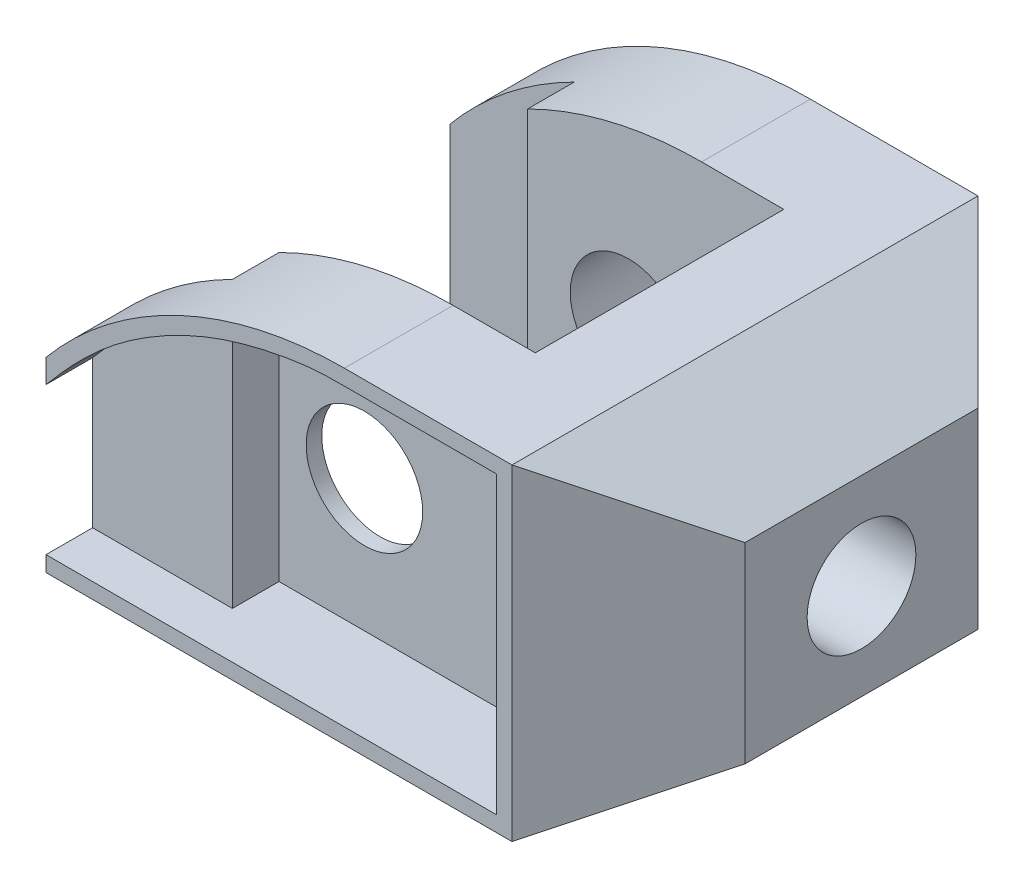
ISO-10303-21;
HEADER;
FILE_DESCRIPTION(('STEP AP214'),'2;1');
FILE_NAME('part.step','',(''),(''),'','','');
FILE_SCHEMA(('AUTOMOTIVE_DESIGN { 1 0 10303 214 1 1 1 1 }'));
ENDSEC;
DATA;
#1=APPLICATION_CONTEXT('core data for automotive mechanical design processes');
#2=APPLICATION_PROTOCOL_DEFINITION('international standard','automotive_design',2000,#1);
#3=PRODUCT_CONTEXT('',#1,'mechanical');
#4=PRODUCT('Part','Part','',(#3));
#5=PRODUCT_RELATED_PRODUCT_CATEGORY('part','',(#4));
#6=PRODUCT_DEFINITION_FORMATION('','',#4);
#7=PRODUCT_DEFINITION_CONTEXT('part definition',#1,'design');
#8=PRODUCT_DEFINITION('design','',#6,#7);
#9=PRODUCT_DEFINITION_SHAPE('','',#8);
#10=(LENGTH_UNIT() NAMED_UNIT(*) SI_UNIT(.MILLI.,.METRE.));
#11=(NAMED_UNIT(*) PLANE_ANGLE_UNIT() SI_UNIT($,.RADIAN.));
#12=(NAMED_UNIT(*) SI_UNIT($,.STERADIAN.) SOLID_ANGLE_UNIT());
#13=UNCERTAINTY_MEASURE_WITH_UNIT(LENGTH_MEASURE(1.E-05),#10,'distance_accuracy_value','');
#14=(GEOMETRIC_REPRESENTATION_CONTEXT(3) GLOBAL_UNCERTAINTY_ASSIGNED_CONTEXT((#13)) GLOBAL_UNIT_ASSIGNED_CONTEXT((#10,
#11,#12)) REPRESENTATION_CONTEXT('',''));
#15=CARTESIAN_POINT('',(0.,0.,0.));
#16=DIRECTION('',(0.,0.,1.));
#17=DIRECTION('',(1.,0.,0.));
#18=AXIS2_PLACEMENT_3D('',#15,#16,#17);
#19=CARTESIAN_POINT('',(29.,-5.,0.));
#20=DIRECTION('',(0.,0.,1.));
#21=DIRECTION('',(1.,0.,0.));
#22=AXIS2_PLACEMENT_3D('',#19,#20,#21);
#23=CYLINDRICAL_SURFACE('',#22,7.5);
#24=CARTESIAN_POINT('',(29.,-5.,46.));
#25=DIRECTION('',(0.,0.,1.));
#26=DIRECTION('',(1.,0.,0.));
#27=AXIS2_PLACEMENT_3D('',#24,#25,#26);
#28=CIRCLE('',#27,7.5);
#29=CARTESIAN_POINT('',(36.5,-5.,46.));
#30=VERTEX_POINT('',#29);
#31=EDGE_CURVE('E529',#30,#30,#28,.F.);
#32=ORIENTED_EDGE('',*,*,#31,.T.);
#33=EDGE_LOOP('',(#32));
#34=FACE_BOUND('',#33,.T.);
#35=CARTESIAN_POINT('',(29.,-5.,48.));
#36=DIRECTION('',(0.,0.,1.));
#37=DIRECTION('',(1.,0.,0.));
#38=AXIS2_PLACEMENT_3D('',#35,#36,#37);
#39=CIRCLE('',#38,7.5);
#40=CARTESIAN_POINT('',(36.5,-5.,48.));
#41=VERTEX_POINT('',#40);
#42=EDGE_CURVE('E342',#41,#41,#39,.F.);
#43=ORIENTED_EDGE('',*,*,#42,.F.);
#44=EDGE_LOOP('',(#43));
#45=FACE_BOUND('',#44,.T.);
#46=ADVANCED_FACE('F144',(#34,#45),#23,.F.);
#47=CARTESIAN_POINT('',(0.,0.,60.));
#48=DIRECTION('',(1.,0.,0.));
#49=DIRECTION('',(0.,0.,-1.));
#50=AXIS2_PLACEMENT_3D('',#47,#48,#49);
#51=PLANE('',#50);
#52=DIRECTION('',(0.,0.,-1.));
#53=VECTOR('',#52,1.);
#54=CARTESIAN_POINT('',(0.,-22.,60.));
#55=LINE('',#54,#53);
#56=CARTESIAN_POINT('',(0.,-22.,60.));
#57=VERTEX_POINT('',#56);
#58=CARTESIAN_POINT('',(0.,-22.,54.));
#59=VERTEX_POINT('',#58);
#60=EDGE_CURVE('E716',#57,#59,#55,.T.);
#61=ORIENTED_EDGE('',*,*,#60,.T.);
#62=DIRECTION('',(0.,1.,0.));
#63=VECTOR('',#62,1.);
#64=CARTESIAN_POINT('',(0.,-22.,54.));
#65=LINE('',#64,#63);
#66=CARTESIAN_POINT('',(0.,-3.04206073150586,54.));
#67=VERTEX_POINT('',#66);
#68=EDGE_CURVE('E719',#59,#67,#65,.T.);
#69=ORIENTED_EDGE('',*,*,#68,.T.);
#70=DIRECTION('',(0.,0.,-1.));
#71=VECTOR('',#70,1.);
#72=CARTESIAN_POINT('',(0.,-3.04206073150586,60.));
#73=LINE('',#72,#71);
#74=CARTESIAN_POINT('',(0.,-3.04206073150586,60.));
#75=VERTEX_POINT('',#74);
#76=EDGE_CURVE('E704',#75,#67,#73,.T.);
#77=ORIENTED_EDGE('',*,*,#76,.F.);
#78=DIRECTION('',(0.,-1.,0.));
#79=VECTOR('',#78,1.);
#80=CARTESIAN_POINT('',(0.,0.,60.));
#81=LINE('',#80,#79);
#82=CARTESIAN_POINT('',(0.,0.,60.));
#83=VERTEX_POINT('',#82);
#84=EDGE_CURVE('E600',#83,#75,#81,.T.);
#85=ORIENTED_EDGE('',*,*,#84,.F.);
#86=DIRECTION('',(0.,0.,-1.));
#87=VECTOR('',#86,1.);
#88=CARTESIAN_POINT('',(0.,0.,60.));
#89=LINE('',#88,#87);
#90=CARTESIAN_POINT('',(0.,0.,52.));
#91=VERTEX_POINT('',#90);
#92=EDGE_CURVE('E613',#83,#91,#89,.T.);
#93=ORIENTED_EDGE('',*,*,#92,.T.);
#94=DIRECTION('',(0.,1.,0.));
#95=VECTOR('',#94,1.);
#96=CARTESIAN_POINT('',(0.,-24.,52.));
#97=LINE('',#96,#95);
#98=CARTESIAN_POINT('',(0.,-24.,52.));
#99=VERTEX_POINT('',#98);
#100=EDGE_CURVE('E488',#99,#91,#97,.T.);
#101=ORIENTED_EDGE('',*,*,#100,.F.);
#102=DIRECTION('',(0.,0.,-1.));
#103=VECTOR('',#102,1.);
#104=CARTESIAN_POINT('',(0.,-24.,60.));
#105=LINE('',#104,#103);
#106=CARTESIAN_POINT('',(0.,-24.,60.));
#107=VERTEX_POINT('',#106);
#108=EDGE_CURVE('E618',#107,#99,#105,.T.);
#109=ORIENTED_EDGE('',*,*,#108,.F.);
#110=EDGE_CURVE('E419',#57,#107,#81,.T.);
#111=ORIENTED_EDGE('',*,*,#110,.F.);
#112=EDGE_LOOP('',(#61,#69,#77,#85,#93,#101,#109,#111));
#113=FACE_BOUND('',#112,.T.);
#114=ADVANCED_FACE('F682',(#113),#51,.F.);
#115=CARTESIAN_POINT('',(0.,0.,60.));
#116=DIRECTION('',(0.,0.,1.));
#117=DIRECTION('',(1.,0.,0.));
#118=AXIS2_PLACEMENT_3D('',#115,#116,#117);
#119=PLANE('',#118);
#120=DIRECTION('',(0.,1.,0.));
#121=VECTOR('',#120,1.);
#122=CARTESIAN_POINT('',(58.,-22.0000000000001,60.));
#123=LINE('',#122,#121);
#124=CARTESIAN_POINT('',(58.,-22.0000000000001,60.));
#125=VERTEX_POINT('',#124);
#126=CARTESIAN_POINT('',(58.,16.,60.));
#127=VERTEX_POINT('',#126);
#128=EDGE_CURVE('E445',#125,#127,#123,.T.);
#129=ORIENTED_EDGE('',*,*,#128,.F.);
#130=DIRECTION('',(-1.,0.,0.));
#131=VECTOR('',#130,1.);
#132=CARTESIAN_POINT('',(2.,-22.,60.));
#133=LINE('',#132,#131);
#134=EDGE_CURVE('E440',#125,#57,#133,.T.);
#135=ORIENTED_EDGE('',*,*,#134,.T.);
#136=ORIENTED_EDGE('',*,*,#110,.T.);
#137=DIRECTION('',(1.,0.,0.));
#138=VECTOR('',#137,1.);
#139=CARTESIAN_POINT('',(0.,-24.,60.));
#140=LINE('',#139,#138);
#141=CARTESIAN_POINT('',(60.,-24.,60.));
#142=VERTEX_POINT('',#141);
#143=EDGE_CURVE('E597',#107,#142,#140,.T.);
#144=ORIENTED_EDGE('',*,*,#143,.T.);
#145=DIRECTION('',(0.,1.,0.));
#146=VECTOR('',#145,1.);
#147=CARTESIAN_POINT('',(60.,-24.,60.));
#148=LINE('',#147,#146);
#149=CARTESIAN_POINT('',(60.,18.,60.));
#150=VERTEX_POINT('',#149);
#151=EDGE_CURVE('E553',#142,#150,#148,.T.);
#152=ORIENTED_EDGE('',*,*,#151,.T.);
#153=DIRECTION('',(-1.,0.,0.));
#154=VECTOR('',#153,1.);
#155=CARTESIAN_POINT('',(0.,18.,60.));
#156=LINE('',#155,#154);
#157=CARTESIAN_POINT('',(38.4187454245971,18.,60.));
#158=VERTEX_POINT('',#157);
#159=EDGE_CURVE('E588',#150,#158,#156,.T.);
#160=ORIENTED_EDGE('',*,*,#159,.T.);
#161=CARTESIAN_POINT('',(38.4187454245971,-32.,60.));
#162=DIRECTION('',(0.,0.,1.));
#163=DIRECTION('',(1.,0.,0.));
#164=AXIS2_PLACEMENT_3D('',#161,#162,#163);
#165=CIRCLE('',#164,50.);
#166=EDGE_CURVE('E592',#158,#83,#165,.T.);
#167=ORIENTED_EDGE('',*,*,#166,.T.);
#168=ORIENTED_EDGE('',*,*,#84,.T.);
#169=DIRECTION('',(-0.655018190479748,-0.755613108767071,0.));
#170=VECTOR('',#169,1.);
#171=CARTESIAN_POINT('',(1.99999999990717,-0.734909205901433,60.));
#172=LINE('',#171,#170);
#173=CARTESIAN_POINT('',(1.99999999990717,-0.734909205901433,60.));
#174=VERTEX_POINT('',#173);
#175=EDGE_CURVE('E400',#174,#75,#172,.T.);
#176=ORIENTED_EDGE('',*,*,#175,.F.);
#177=CARTESIAN_POINT('',(38.4187454245973,16.,60.));
#178=CARTESIAN_POINT('',(37.8594597344291,16.,60.));
#179=CARTESIAN_POINT('',(37.3001740442608,16.,60.));
#180=CARTESIAN_POINT('',(36.7409679291251,15.9956791731657,60.));
#181=CARTESIAN_POINT('',(35.0638270339129,15.9567917316575,60.));
#182=CARTESIAN_POINT('',(33.3888346645778,15.8012419656242,60.));
#183=CARTESIAN_POINT('',(32.2748255345968,15.6544752961856,60.));
#184=CARTESIAN_POINT('',(29.5006777065477,15.2018493005339,60.));
#185=CARTESIAN_POINT('',(26.7643270531672,14.5898443534607,60.));
#186=CARTESIAN_POINT('',(25.1400349332566,14.1598562930065,60.));
#187=CARTESIAN_POINT('',(21.9343098161441,13.1634926482811,60.));
#188=CARTESIAN_POINT('',(18.8299481013969,11.872719277128,60.));
#189=CARTESIAN_POINT('',(17.3066151513577,11.1577906166589,60.));
#190=CARTESIAN_POINT('',(14.3246591794342,9.59697025936475,60.));
#191=CARTESIAN_POINT('',(11.486151290793,7.79046565621635,60.));
#192=CARTESIAN_POINT('',(10.1080328527363,6.8258165538729,60.));
#193=CARTESIAN_POINT('',(7.88522025551142,5.11324040744338,60.));
#194=CARTESIAN_POINT('',(5.8063969048683,3.22974574057671,60.));
#195=CARTESIAN_POINT('',(4.99459382906211,2.450822480035,60.));
#196=CARTESIAN_POINT('',(3.90340812394486,1.34949177018028,60.));
#197=CARTESIAN_POINT('',(2.84725718543196,0.216614655587167,60.));
#198=CARTESIAN_POINT('',(2.56073938376813,-0.0970709785771248,60.));
#199=CARTESIAN_POINT('',(2.27811157008045,-0.414086439179782,60.));
#200=CARTESIAN_POINT('',(1.99999999990717,-0.734909205901433,60.));
#201=B_SPLINE_CURVE_WITH_KNOTS('',5,(#177,#178,#179,#180,#181,#182,#183,#184,#185,#186,#187,
#188,#189,#190,#191,#192,#193,#194,#195,#196,#197,#198,#199,#200),.UNSPECIFIED.,.F.,.F.,(6,3,3,
3,3,3,3,6),(0.,0.0677209449021635,0.203162834706491,0.406325669412981,0.609488504119471,
0.812651338825962,0.948596189742204,1.),.UNSPECIFIED.);
#202=CARTESIAN_POINT('',(38.4187454245973,16.,60.));
#203=VERTEX_POINT('',#202);
#204=EDGE_CURVE('E389',#203,#174,#201,.T.);
#205=ORIENTED_EDGE('',*,*,#204,.F.);
#206=DIRECTION('',(-1.,0.,0.));
#207=VECTOR('',#206,1.);
#208=CARTESIAN_POINT('',(58.,16.,60.));
#209=LINE('',#208,#207);
#210=EDGE_CURVE('E162',#127,#203,#209,.T.);
#211=ORIENTED_EDGE('',*,*,#210,.F.);
#212=EDGE_LOOP('',(#129,#135,#136,#144,#152,#160,#167,#168,#176,#205,#211));
#213=FACE_BOUND('',#212,.T.);
#214=ADVANCED_FACE('F676',(#213),#119,.T.);
#215=CARTESIAN_POINT('',(38.4187454245971,-32.,60.));
#216=DIRECTION('',(0.,0.,-1.));
#217=DIRECTION('',(-1.,0.,0.));
#218=AXIS2_PLACEMENT_3D('',#215,#216,#217);
#219=CYLINDRICAL_SURFACE('',#218,50.);
#220=CARTESIAN_POINT('',(0.,0.,8.));
#221=VERTEX_POINT('',#220);
#222=CARTESIAN_POINT('',(0.,0.,0.));
#223=VERTEX_POINT('',#222);
#224=EDGE_CURVE('E617',#221,#223,#89,.T.);
#225=ORIENTED_EDGE('',*,*,#224,.F.);
#226=CARTESIAN_POINT('',(38.4187454245971,-32.,8.));
#227=DIRECTION('',(0.,0.,-1.));
#228=DIRECTION('',(-1.,0.,0.));
#229=AXIS2_PLACEMENT_3D('',#226,#227,#228);
#230=CIRCLE('',#229,50.);
#231=CARTESIAN_POINT('',(16.,12.6922795747443,8.));
#232=VERTEX_POINT('',#231);
#233=EDGE_CURVE('E509',#221,#232,#230,.T.);
#234=ORIENTED_EDGE('',*,*,#233,.T.);
#235=DIRECTION('',(0.,0.,-1.));
#236=VECTOR('',#235,1.);
#237=CARTESIAN_POINT('',(16.,12.6922795747443,60.));
#238=LINE('',#237,#236);
#239=CARTESIAN_POINT('',(16.,12.6922795747443,14.));
#240=VERTEX_POINT('',#239);
#241=EDGE_CURVE('E501',#232,#240,#238,.F.);
#242=ORIENTED_EDGE('',*,*,#241,.T.);
#243=CARTESIAN_POINT('',(38.4187454245971,-32.,14.));
#244=DIRECTION('',(0.,0.,-1.));
#245=DIRECTION('',(-1.,0.,0.));
#246=AXIS2_PLACEMENT_3D('',#243,#244,#245);
#247=CIRCLE('',#246,50.);
#248=CARTESIAN_POINT('',(38.4187454245971,18.,14.));
#249=VERTEX_POINT('',#248);
#250=EDGE_CURVE('E542',#240,#249,#247,.T.);
#251=ORIENTED_EDGE('',*,*,#250,.T.);
#252=DIRECTION('',(0.,0.,-1.));
#253=VECTOR('',#252,1.);
#254=CARTESIAN_POINT('',(38.4187454245971,18.,60.));
#255=LINE('',#254,#253);
#256=CARTESIAN_POINT('',(38.4187454245971,18.,0.));
#257=VERTEX_POINT('',#256);
#258=EDGE_CURVE('E154',#249,#257,#255,.T.);
#259=ORIENTED_EDGE('',*,*,#258,.T.);
#260=CARTESIAN_POINT('',(38.4187454245971,-32.,0.));
#261=DIRECTION('',(0.,0.,1.));
#262=DIRECTION('',(1.,0.,0.));
#263=AXIS2_PLACEMENT_3D('',#260,#261,#262);
#264=CIRCLE('',#263,50.);
#265=EDGE_CURVE('E646',#257,#223,#264,.T.);
#266=ORIENTED_EDGE('',*,*,#265,.T.);
#267=EDGE_LOOP('',(#225,#234,#242,#251,#259,#266));
#268=FACE_BOUND('',#267,.T.);
#269=ADVANCED_FACE('F664',(#268),#219,.T.);
#270=CARTESIAN_POINT('',(0.,-24.,8.));
#271=VERTEX_POINT('',#270);
#272=CARTESIAN_POINT('',(0.,-24.,0.));
#273=VERTEX_POINT('',#272);
#274=EDGE_CURVE('E622',#271,#273,#105,.T.);
#275=ORIENTED_EDGE('',*,*,#274,.F.);
#276=DIRECTION('',(0.,1.,0.));
#277=VECTOR('',#276,1.);
#278=CARTESIAN_POINT('',(0.,-24.,8.));
#279=LINE('',#278,#277);
#280=EDGE_CURVE('E470',#271,#221,#279,.T.);
#281=ORIENTED_EDGE('',*,*,#280,.T.);
#282=ORIENTED_EDGE('',*,*,#224,.T.);
#283=DIRECTION('',(0.,-1.,0.));
#284=VECTOR('',#283,1.);
#285=CARTESIAN_POINT('',(0.,0.,0.));
#286=LINE('',#285,#284);
#287=EDGE_CURVE('E642',#223,#273,#286,.T.);
#288=ORIENTED_EDGE('',*,*,#287,.T.);
#289=EDGE_LOOP('',(#275,#281,#282,#288));
#290=FACE_BOUND('',#289,.T.);
#291=ADVANCED_FACE('F758',(#290),#51,.F.);
#292=CARTESIAN_POINT('',(29.,-5.,14.));
#293=DIRECTION('',(0.,0.,-1.));
#294=DIRECTION('',(-1.,0.,0.));
#295=AXIS2_PLACEMENT_3D('',#292,#293,#294);
#296=CIRCLE('',#295,7.5);
#297=CARTESIAN_POINT('',(21.5,-5.,14.));
#298=VERTEX_POINT('',#297);
#299=EDGE_CURVE('E541',#298,#298,#296,.F.);
#300=ORIENTED_EDGE('',*,*,#299,.T.);
#301=EDGE_LOOP('',(#300));
#302=FACE_BOUND('',#301,.T.);
#303=CARTESIAN_POINT('',(29.,-5.,0.));
#304=DIRECTION('',(0.,0.,1.));
#305=DIRECTION('',(1.,0.,0.));
#306=AXIS2_PLACEMENT_3D('',#303,#304,#305);
#307=CIRCLE('',#306,7.5);
#308=CARTESIAN_POINT('',(36.5,-5.,0.));
#309=VERTEX_POINT('',#308);
#310=EDGE_CURVE('E583',#309,#309,#307,.T.);
#311=ORIENTED_EDGE('',*,*,#310,.F.);
#312=EDGE_LOOP('',(#311));
#313=FACE_BOUND('',#312,.T.);
#314=ADVANCED_FACE('F753',(#302,#313),#23,.F.);
#315=CARTESIAN_POINT('',(0.,18.,60.));
#316=DIRECTION('',(0.,-1.,0.));
#317=DIRECTION('',(1.,0.,0.));
#318=AXIS2_PLACEMENT_3D('',#315,#316,#317);
#319=PLANE('',#318);
#320=ORIENTED_EDGE('',*,*,#258,.F.);
#321=DIRECTION('',(1.,0.,0.));
#322=VECTOR('',#321,1.);
#323=CARTESIAN_POINT('',(0.,18.,14.));
#324=LINE('',#323,#322);
#325=CARTESIAN_POINT('',(49.,18.,14.));
#326=VERTEX_POINT('',#325);
#327=EDGE_CURVE('E545',#249,#326,#324,.T.);
#328=ORIENTED_EDGE('',*,*,#327,.T.);
#329=DIRECTION('',(0.,0.,1.));
#330=VECTOR('',#329,1.);
#331=CARTESIAN_POINT('',(49.,18.,60.));
#332=LINE('',#331,#330);
#333=CARTESIAN_POINT('',(49.,18.,46.));
#334=VERTEX_POINT('',#333);
#335=EDGE_CURVE('E549',#326,#334,#332,.T.);
#336=ORIENTED_EDGE('',*,*,#335,.T.);
#337=DIRECTION('',(-1.,0.,0.));
#338=VECTOR('',#337,1.);
#339=CARTESIAN_POINT('',(0.,18.,46.));
#340=LINE('',#339,#338);
#341=CARTESIAN_POINT('',(38.4187454245971,18.,46.));
#342=VERTEX_POINT('',#341);
#343=EDGE_CURVE('E537',#334,#342,#340,.T.);
#344=ORIENTED_EDGE('',*,*,#343,.T.);
#345=EDGE_CURVE('E14',#158,#342,#255,.T.);
#346=ORIENTED_EDGE('',*,*,#345,.F.);
#347=ORIENTED_EDGE('',*,*,#159,.F.);
#348=DIRECTION('',(0.,0.,-1.));
#349=VECTOR('',#348,1.);
#350=CARTESIAN_POINT('',(60.,18.,60.));
#351=LINE('',#350,#349);
#352=CARTESIAN_POINT('',(60.,18.,0.));
#353=VERTEX_POINT('',#352);
#354=EDGE_CURVE('E635',#150,#353,#351,.T.);
#355=ORIENTED_EDGE('',*,*,#354,.T.);
#356=DIRECTION('',(-1.,0.,0.));
#357=VECTOR('',#356,1.);
#358=CARTESIAN_POINT('',(0.,18.,0.));
#359=LINE('',#358,#357);
#360=EDGE_CURVE('E587',#353,#257,#359,.T.);
#361=ORIENTED_EDGE('',*,*,#360,.T.);
#362=EDGE_LOOP('',(#320,#328,#336,#344,#346,#347,#355,#361));
#363=FACE_BOUND('',#362,.T.);
#364=ADVANCED_FACE('F146',(#363),#319,.F.);
#365=CARTESIAN_POINT('',(38.4187454245971,-32.,46.));
#366=DIRECTION('',(0.,0.,1.));
#367=DIRECTION('',(1.,0.,0.));
#368=AXIS2_PLACEMENT_3D('',#365,#366,#367);
#369=CIRCLE('',#368,50.);
#370=CARTESIAN_POINT('',(16.,12.6922795747443,46.));
#371=VERTEX_POINT('',#370);
#372=EDGE_CURVE('E533',#342,#371,#369,.T.);
#373=ORIENTED_EDGE('',*,*,#372,.T.);
#374=DIRECTION('',(0.,0.,-1.));
#375=VECTOR('',#374,1.);
#376=CARTESIAN_POINT('',(16.,12.6922795747443,60.));
#377=LINE('',#376,#375);
#378=CARTESIAN_POINT('',(16.,12.6922795747443,52.));
#379=VERTEX_POINT('',#378);
#380=EDGE_CURVE('E474',#371,#379,#377,.F.);
#381=ORIENTED_EDGE('',*,*,#380,.T.);
#382=CARTESIAN_POINT('',(38.4187454245971,-32.,52.));
#383=DIRECTION('',(0.,0.,1.));
#384=DIRECTION('',(1.,0.,0.));
#385=AXIS2_PLACEMENT_3D('',#382,#383,#384);
#386=CIRCLE('',#385,50.);
#387=EDGE_CURVE('E505',#379,#91,#386,.T.);
#388=ORIENTED_EDGE('',*,*,#387,.T.);
#389=ORIENTED_EDGE('',*,*,#92,.F.);
#390=ORIENTED_EDGE('',*,*,#166,.F.);
#391=ORIENTED_EDGE('',*,*,#345,.T.);
#392=EDGE_LOOP('',(#373,#381,#388,#389,#390,#391));
#393=FACE_BOUND('',#392,.T.);
#394=ADVANCED_FACE('F699',(#393),#219,.T.);
#395=CARTESIAN_POINT('',(0.,-24.,60.));
#396=DIRECTION('',(0.,1.,0.));
#397=DIRECTION('',(0.,0.,1.));
#398=AXIS2_PLACEMENT_3D('',#395,#396,#397);
#399=PLANE('',#398);
#400=DIRECTION('',(0.,0.,-1.));
#401=VECTOR('',#400,1.);
#402=CARTESIAN_POINT('',(16.,-24.,14.));
#403=LINE('',#402,#401);
#404=CARTESIAN_POINT('',(16.,-24.,14.));
#405=VERTEX_POINT('',#404);
#406=CARTESIAN_POINT('',(16.,-24.,8.));
#407=VERTEX_POINT('',#406);
#408=EDGE_CURVE('E170',#405,#407,#403,.T.);
#409=ORIENTED_EDGE('',*,*,#408,.T.);
#410=DIRECTION('',(-1.,0.,0.));
#411=VECTOR('',#410,1.);
#412=CARTESIAN_POINT('',(0.,-24.,8.));
#413=LINE('',#412,#411);
#414=EDGE_CURVE('E464',#407,#271,#413,.T.);
#415=ORIENTED_EDGE('',*,*,#414,.T.);
#416=ORIENTED_EDGE('',*,*,#274,.T.);
#417=DIRECTION('',(1.,0.,0.));
#418=VECTOR('',#417,1.);
#419=CARTESIAN_POINT('',(0.,-24.,0.));
#420=LINE('',#419,#418);
#421=CARTESIAN_POINT('',(60.,-24.,0.));
#422=VERTEX_POINT('',#421);
#423=EDGE_CURVE('E593',#273,#422,#420,.T.);
#424=ORIENTED_EDGE('',*,*,#423,.T.);
#425=DIRECTION('',(0.,0.,-1.));
#426=VECTOR('',#425,1.);
#427=CARTESIAN_POINT('',(60.,-24.,60.));
#428=LINE('',#427,#426);
#429=EDGE_CURVE('E623',#142,#422,#428,.T.);
#430=ORIENTED_EDGE('',*,*,#429,.F.);
#431=ORIENTED_EDGE('',*,*,#143,.F.);
#432=ORIENTED_EDGE('',*,*,#108,.T.);
#433=DIRECTION('',(1.,0.,0.));
#434=VECTOR('',#433,1.);
#435=CARTESIAN_POINT('',(0.,-24.,52.));
#436=LINE('',#435,#434);
#437=CARTESIAN_POINT('',(16.,-24.,52.));
#438=VERTEX_POINT('',#437);
#439=EDGE_CURVE('E461',#99,#438,#436,.T.);
#440=ORIENTED_EDGE('',*,*,#439,.T.);
#441=DIRECTION('',(0.,0.,-1.));
#442=VECTOR('',#441,1.);
#443=CARTESIAN_POINT('',(16.,-24.,46.));
#444=LINE('',#443,#442);
#445=CARTESIAN_POINT('',(16.,-24.,46.));
#446=VERTEX_POINT('',#445);
#447=EDGE_CURVE('E484',#438,#446,#444,.T.);
#448=ORIENTED_EDGE('',*,*,#447,.T.);
#449=DIRECTION('',(1.,0.,0.));
#450=VECTOR('',#449,1.);
#451=CARTESIAN_POINT('',(0.,-24.,46.));
#452=LINE('',#451,#450);
#453=CARTESIAN_POINT('',(49.,-24.,46.));
#454=VERTEX_POINT('',#453);
#455=EDGE_CURVE('E513',#446,#454,#452,.T.);
#456=ORIENTED_EDGE('',*,*,#455,.T.);
#457=DIRECTION('',(0.,0.,-1.));
#458=VECTOR('',#457,1.);
#459=CARTESIAN_POINT('',(49.,-24.,14.));
#460=LINE('',#459,#458);
#461=CARTESIAN_POINT('',(49.,-24.,14.));
#462=VERTEX_POINT('',#461);
#463=EDGE_CURVE('E516',#454,#462,#460,.T.);
#464=ORIENTED_EDGE('',*,*,#463,.T.);
#465=DIRECTION('',(-1.,0.,0.));
#466=VECTOR('',#465,1.);
#467=CARTESIAN_POINT('',(0.,-24.,14.));
#468=LINE('',#467,#466);
#469=EDGE_CURVE('E520',#462,#405,#468,.T.);
#470=ORIENTED_EDGE('',*,*,#469,.T.);
#471=EDGE_LOOP('',(#409,#415,#416,#424,#430,#431,#432,#440,#448,#456,#464,#470));
#472=FACE_BOUND('',#471,.T.);
#473=ADVANCED_FACE('F684',(#472),#399,.F.);
#474=CARTESIAN_POINT('',(25.3923048454134,-43.9807621135332,60.));
#475=DIRECTION('',(-0.500000000000001,0.866025403784438,0.));
#476=DIRECTION('',(-0.866025403784438,-0.500000000000001,0.));
#477=AXIS2_PLACEMENT_3D('',#474,#475,#476);
#478=PLANE('',#477);
#479=ORIENTED_EDGE('',*,*,#429,.T.);
#480=DIRECTION('',(0.65465367070798,0.37796447300923,0.654653670707973));
#481=VECTOR('',#480,1.);
#482=CARTESIAN_POINT('',(65.9384599116645,-20.5714285714287,5.93845991166445));
#483=LINE('',#482,#481);
#484=CARTESIAN_POINT('',(75.,-15.3397459621556,14.9999999999998));
#485=VERTEX_POINT('',#484);
#486=EDGE_CURVE('E571',#422,#485,#483,.T.);
#487=ORIENTED_EDGE('',*,*,#486,.T.);
#488=DIRECTION('',(0.,0.,-1.));
#489=VECTOR('',#488,1.);
#490=CARTESIAN_POINT('',(75.,-15.3397459621556,60.));
#491=LINE('',#490,#489);
#492=CARTESIAN_POINT('',(75.,-15.3397459621556,45.0000000000002));
#493=VERTEX_POINT('',#492);
#494=EDGE_CURVE('E627',#493,#485,#491,.T.);
#495=ORIENTED_EDGE('',*,*,#494,.F.);
#496=DIRECTION('',(-0.65465367070798,-0.37796447300923,0.654653670707973));
#497=VECTOR('',#496,1.);
#498=CARTESIAN_POINT('',(40.2241741973789,-35.4175783505905,79.7758258026209));
#499=LINE('',#498,#497);
#500=EDGE_CURVE('E579',#493,#142,#499,.T.);
#501=ORIENTED_EDGE('',*,*,#500,.T.);
#502=EDGE_LOOP('',(#479,#487,#495,#501));
#503=FACE_BOUND('',#502,.T.);
#504=ADVANCED_FACE('F686',(#503),#478,.F.);
#505=CARTESIAN_POINT('',(75.,0.,60.));
#506=DIRECTION('',(-1.,0.,0.));
#507=DIRECTION('',(0.,0.,1.));
#508=AXIS2_PLACEMENT_3D('',#505,#506,#507);
#509=PLANE('',#508);
#510=CARTESIAN_POINT('',(75.,-3.00000000000001,30.));
#511=DIRECTION('',(-1.,0.,0.));
#512=DIRECTION('',(0.,0.,1.));
#513=AXIS2_PLACEMENT_3D('',#510,#511,#512);
#514=CIRCLE('',#513,7.);
#515=CARTESIAN_POINT('',(75.,-3.00000000000001,37.));
#516=VERTEX_POINT('',#515);
#517=EDGE_CURVE('E457',#516,#516,#514,.T.);
#518=ORIENTED_EDGE('',*,*,#517,.T.);
#519=EDGE_LOOP('',(#518));
#520=FACE_BOUND('',#519,.T.);
#521=ORIENTED_EDGE('',*,*,#494,.T.);
#522=DIRECTION('',(0.,1.,0.));
#523=VECTOR('',#522,1.);
#524=CARTESIAN_POINT('',(75.,-24.,14.9999999999998));
#525=LINE('',#524,#523);
#526=CARTESIAN_POINT('',(75.,9.33974596215575,14.9999999999998));
#527=VERTEX_POINT('',#526);
#528=EDGE_CURVE('E554',#485,#527,#525,.T.);
#529=ORIENTED_EDGE('',*,*,#528,.T.);
#530=DIRECTION('',(0.,0.,-1.));
#531=VECTOR('',#530,1.);
#532=CARTESIAN_POINT('',(75.,9.33974596215575,60.));
#533=LINE('',#532,#531);
#534=CARTESIAN_POINT('',(75.,9.33974596215573,45.0000000000002));
#535=VERTEX_POINT('',#534);
#536=EDGE_CURVE('E631',#535,#527,#533,.T.);
#537=ORIENTED_EDGE('',*,*,#536,.F.);
#538=DIRECTION('',(0.,1.,0.));
#539=VECTOR('',#538,1.);
#540=CARTESIAN_POINT('',(75.,-24.,45.0000000000002));
#541=LINE('',#540,#539);
#542=EDGE_CURVE('E562',#493,#535,#541,.T.);
#543=ORIENTED_EDGE('',*,*,#542,.F.);
#544=EDGE_LOOP('',(#521,#529,#537,#543));
#545=FACE_BOUND('',#544,.T.);
#546=ADVANCED_FACE('F693',(#520,#545),#509,.F.);
#547=CARTESIAN_POINT('',(22.7942286340595,39.4807621135331,60.));
#548=DIRECTION('',(-0.499999999999994,-0.866025403784442,0.));
#549=DIRECTION('',(0.866025403784442,-0.499999999999994,0.));
#550=AXIS2_PLACEMENT_3D('',#547,#548,#549);
#551=PLANE('',#550);
#552=ORIENTED_EDGE('',*,*,#536,.T.);
#553=DIRECTION('',(-0.654653670707982,0.377964473009224,-0.654653670707975));
#554=VECTOR('',#553,1.);
#555=CARTESIAN_POINT('',(64.4538449337483,15.4285714285716,4.45384493374822));
#556=LINE('',#555,#554);
#557=EDGE_CURVE('E558',#527,#353,#556,.T.);
#558=ORIENTED_EDGE('',*,*,#557,.T.);
#559=ORIENTED_EDGE('',*,*,#354,.F.);
#560=DIRECTION('',(0.654653670707982,-0.377964473009224,-0.654653670707975));
#561=VECTOR('',#560,1.);
#562=CARTESIAN_POINT('',(38.7395592194625,30.2747212077332,81.2604407805373));
#563=LINE('',#562,#561);
#564=EDGE_CURVE('E575',#150,#535,#563,.T.);
#565=ORIENTED_EDGE('',*,*,#564,.T.);
#566=EDGE_LOOP('',(#552,#558,#559,#565));
#567=FACE_BOUND('',#566,.T.);
#568=ADVANCED_FACE('F695',(#567),#551,.F.);
#569=CARTESIAN_POINT('',(0.,0.,0.));
#570=DIRECTION('',(0.,0.,1.));
#571=DIRECTION('',(1.,0.,0.));
#572=AXIS2_PLACEMENT_3D('',#569,#570,#571);
#573=PLANE('',#572);
#574=ORIENTED_EDGE('',*,*,#310,.T.);
#575=EDGE_LOOP('',(#574));
#576=FACE_BOUND('',#575,.T.);
#577=ORIENTED_EDGE('',*,*,#360,.F.);
#578=DIRECTION('',(0.,1.,0.));
#579=VECTOR('',#578,1.);
#580=CARTESIAN_POINT('',(60.,-24.,0.));
#581=LINE('',#580,#579);
#582=EDGE_CURVE('E559',#422,#353,#581,.T.);
#583=ORIENTED_EDGE('',*,*,#582,.F.);
#584=ORIENTED_EDGE('',*,*,#423,.F.);
#585=ORIENTED_EDGE('',*,*,#287,.F.);
#586=ORIENTED_EDGE('',*,*,#265,.F.);
#587=EDGE_LOOP('',(#577,#583,#584,#585,#586));
#588=FACE_BOUND('',#587,.T.);
#589=ADVANCED_FACE('F659',(#576,#588),#573,.F.);
#590=CARTESIAN_POINT('',(60.,-24.,0.));
#591=DIRECTION('',(-0.707106781186544,0.,0.707106781186551));
#592=DIRECTION('',(0.707106781186551,0.,0.707106781186544));
#593=AXIS2_PLACEMENT_3D('',#590,#591,#592);
#594=PLANE('',#593);
#595=ORIENTED_EDGE('',*,*,#582,.T.);
#596=ORIENTED_EDGE('',*,*,#557,.F.);
#597=ORIENTED_EDGE('',*,*,#528,.F.);
#598=ORIENTED_EDGE('',*,*,#486,.F.);
#599=EDGE_LOOP('',(#595,#596,#597,#598));
#600=FACE_BOUND('',#599,.T.);
#601=ADVANCED_FACE('F773',(#600),#594,.F.);
#602=CARTESIAN_POINT('',(75.,-24.,45.0000000000002));
#603=DIRECTION('',(-0.707106781186544,0.,-0.707106781186551));
#604=DIRECTION('',(-0.707106781186551,0.,0.707106781186544));
#605=AXIS2_PLACEMENT_3D('',#602,#603,#604);
#606=PLANE('',#605);
#607=ORIENTED_EDGE('',*,*,#542,.T.);
#608=ORIENTED_EDGE('',*,*,#564,.F.);
#609=ORIENTED_EDGE('',*,*,#151,.F.);
#610=ORIENTED_EDGE('',*,*,#500,.F.);
#611=EDGE_LOOP('',(#607,#608,#609,#610));
#612=FACE_BOUND('',#611,.T.);
#613=ADVANCED_FACE('F690',(#612),#606,.F.);
#614=CARTESIAN_POINT('',(49.,-24.,14.));
#615=DIRECTION('',(1.,0.,0.));
#616=DIRECTION('',(0.,0.,-1.));
#617=AXIS2_PLACEMENT_3D('',#614,#615,#616);
#618=PLANE('',#617);
#619=CARTESIAN_POINT('',(49.,-3.00000000000001,30.));
#620=DIRECTION('',(1.,0.,0.));
#621=DIRECTION('',(0.,0.,-1.));
#622=AXIS2_PLACEMENT_3D('',#619,#620,#621);
#623=CIRCLE('',#622,7.);
#624=CARTESIAN_POINT('',(49.,-3.00000000000001,23.));
#625=VERTEX_POINT('',#624);
#626=EDGE_CURVE('E394',#625,#625,#623,.T.);
#627=ORIENTED_EDGE('',*,*,#626,.T.);
#628=EDGE_LOOP('',(#627));
#629=FACE_BOUND('',#628,.T.);
#630=DIRECTION('',(0.,1.,0.));
#631=VECTOR('',#630,1.);
#632=CARTESIAN_POINT('',(49.,-24.,14.));
#633=LINE('',#632,#631);
#634=EDGE_CURVE('E525',#462,#326,#633,.T.);
#635=ORIENTED_EDGE('',*,*,#634,.F.);
#636=ORIENTED_EDGE('',*,*,#463,.F.);
#637=DIRECTION('',(0.,1.,0.));
#638=VECTOR('',#637,1.);
#639=CARTESIAN_POINT('',(49.,-24.,46.));
#640=LINE('',#639,#638);
#641=EDGE_CURVE('E524',#454,#334,#640,.T.);
#642=ORIENTED_EDGE('',*,*,#641,.T.);
#643=ORIENTED_EDGE('',*,*,#335,.F.);
#644=EDGE_LOOP('',(#635,#636,#642,#643));
#645=FACE_BOUND('',#644,.T.);
#646=ADVANCED_FACE('F822',(#629,#645),#618,.F.);
#647=CARTESIAN_POINT('',(0.,-24.,14.));
#648=DIRECTION('',(0.,0.,-1.));
#649=DIRECTION('',(-1.,0.,0.));
#650=AXIS2_PLACEMENT_3D('',#647,#648,#649);
#651=PLANE('',#650);
#652=ORIENTED_EDGE('',*,*,#299,.F.);
#653=EDGE_LOOP('',(#652));
#654=FACE_BOUND('',#653,.T.);
#655=ORIENTED_EDGE('',*,*,#250,.F.);
#656=DIRECTION('',(0.,1.,0.));
#657=VECTOR('',#656,1.);
#658=CARTESIAN_POINT('',(16.,-24.,14.));
#659=LINE('',#658,#657);
#660=EDGE_CURVE('E469',#405,#240,#659,.T.);
#661=ORIENTED_EDGE('',*,*,#660,.F.);
#662=ORIENTED_EDGE('',*,*,#469,.F.);
#663=ORIENTED_EDGE('',*,*,#634,.T.);
#664=ORIENTED_EDGE('',*,*,#327,.F.);
#665=EDGE_LOOP('',(#655,#661,#662,#663,#664));
#666=FACE_BOUND('',#665,.T.);
#667=ADVANCED_FACE('F827',(#654,#666),#651,.F.);
#668=CARTESIAN_POINT('',(0.,-24.,46.));
#669=DIRECTION('',(0.,0.,1.));
#670=DIRECTION('',(1.,0.,0.));
#671=AXIS2_PLACEMENT_3D('',#668,#669,#670);
#672=PLANE('',#671);
#673=ORIENTED_EDGE('',*,*,#31,.F.);
#674=EDGE_LOOP('',(#673));
#675=FACE_BOUND('',#674,.T.);
#676=ORIENTED_EDGE('',*,*,#455,.F.);
#677=DIRECTION('',(0.,1.,0.));
#678=VECTOR('',#677,1.);
#679=CARTESIAN_POINT('',(16.,-24.,46.));
#680=LINE('',#679,#678);
#681=EDGE_CURVE('E465',#446,#371,#680,.T.);
#682=ORIENTED_EDGE('',*,*,#681,.T.);
#683=ORIENTED_EDGE('',*,*,#372,.F.);
#684=ORIENTED_EDGE('',*,*,#343,.F.);
#685=ORIENTED_EDGE('',*,*,#641,.F.);
#686=EDGE_LOOP('',(#676,#682,#683,#684,#685));
#687=FACE_BOUND('',#686,.T.);
#688=ADVANCED_FACE('F876',(#675,#687),#672,.F.);
#689=CARTESIAN_POINT('',(0.,-24.,52.));
#690=DIRECTION('',(0.,0.,1.));
#691=DIRECTION('',(1.,0.,0.));
#692=AXIS2_PLACEMENT_3D('',#689,#690,#691);
#693=PLANE('',#692);
#694=DIRECTION('',(0.,1.,0.));
#695=VECTOR('',#694,1.);
#696=CARTESIAN_POINT('',(16.,-24.,52.));
#697=LINE('',#696,#695);
#698=EDGE_CURVE('E492',#438,#379,#697,.T.);
#699=ORIENTED_EDGE('',*,*,#698,.F.);
#700=ORIENTED_EDGE('',*,*,#439,.F.);
#701=ORIENTED_EDGE('',*,*,#100,.T.);
#702=ORIENTED_EDGE('',*,*,#387,.F.);
#703=EDGE_LOOP('',(#699,#700,#701,#702));
#704=FACE_BOUND('',#703,.T.);
#705=ADVANCED_FACE('F866',(#704),#693,.F.);
#706=CARTESIAN_POINT('',(16.,-24.,46.));
#707=DIRECTION('',(1.,0.,0.));
#708=DIRECTION('',(0.,1.,0.));
#709=AXIS2_PLACEMENT_3D('',#706,#707,#708);
#710=PLANE('',#709);
#711=ORIENTED_EDGE('',*,*,#681,.F.);
#712=ORIENTED_EDGE('',*,*,#447,.F.);
#713=ORIENTED_EDGE('',*,*,#698,.T.);
#714=ORIENTED_EDGE('',*,*,#380,.F.);
#715=EDGE_LOOP('',(#711,#712,#713,#714));
#716=FACE_BOUND('',#715,.T.);
#717=ADVANCED_FACE('F856',(#716),#710,.F.);
#718=CARTESIAN_POINT('',(0.,-24.,8.));
#719=DIRECTION('',(0.,0.,-1.));
#720=DIRECTION('',(-1.,0.,0.));
#721=AXIS2_PLACEMENT_3D('',#718,#719,#720);
#722=PLANE('',#721);
#723=ORIENTED_EDGE('',*,*,#280,.F.);
#724=ORIENTED_EDGE('',*,*,#414,.F.);
#725=DIRECTION('',(0.,1.,0.));
#726=VECTOR('',#725,1.);
#727=CARTESIAN_POINT('',(16.,-24.,8.));
#728=LINE('',#727,#726);
#729=EDGE_CURVE('E475',#407,#232,#728,.T.);
#730=ORIENTED_EDGE('',*,*,#729,.T.);
#731=ORIENTED_EDGE('',*,*,#233,.F.);
#732=EDGE_LOOP('',(#723,#724,#730,#731));
#733=FACE_BOUND('',#732,.T.);
#734=ADVANCED_FACE('F847',(#733),#722,.F.);
#735=CARTESIAN_POINT('',(16.,-24.,14.));
#736=DIRECTION('',(1.,0.,0.));
#737=DIRECTION('',(0.,1.,0.));
#738=AXIS2_PLACEMENT_3D('',#735,#736,#737);
#739=PLANE('',#738);
#740=ORIENTED_EDGE('',*,*,#729,.F.);
#741=ORIENTED_EDGE('',*,*,#408,.F.);
#742=ORIENTED_EDGE('',*,*,#660,.T.);
#743=ORIENTED_EDGE('',*,*,#241,.F.);
#744=EDGE_LOOP('',(#740,#741,#742,#743));
#745=FACE_BOUND('',#744,.T.);
#746=ADVANCED_FACE('F814',(#745),#739,.F.);
#747=CARTESIAN_POINT('',(0.,-3.00000000000001,30.));
#748=DIRECTION('',(1.,0.,0.));
#749=DIRECTION('',(0.,0.,-1.));
#750=AXIS2_PLACEMENT_3D('',#747,#748,#749);
#751=CYLINDRICAL_SURFACE('',#750,7.);
#752=ORIENTED_EDGE('',*,*,#626,.F.);
#753=EDGE_LOOP('',(#752));
#754=FACE_BOUND('',#753,.T.);
#755=ORIENTED_EDGE('',*,*,#517,.F.);
#756=EDGE_LOOP('',(#755));
#757=FACE_BOUND('',#756,.T.);
#758=ADVANCED_FACE('F746',(#754,#757),#751,.F.);
#759=CARTESIAN_POINT('',(0.,0.,54.));
#760=DIRECTION('',(0.,0.,-1.));
#761=DIRECTION('',(-1.,0.,0.));
#762=AXIS2_PLACEMENT_3D('',#759,#760,#761);
#763=PLANE('',#762);
#764=DIRECTION('',(1.,0.,0.));
#765=VECTOR('',#764,1.);
#766=CARTESIAN_POINT('',(2.,-22.,54.));
#767=LINE('',#766,#765);
#768=CARTESIAN_POINT('',(18.,-22.,54.));
#769=VERTEX_POINT('',#768);
#770=EDGE_CURVE('E430',#59,#769,#767,.T.);
#771=ORIENTED_EDGE('',*,*,#770,.T.);
#772=DIRECTION('',(0.,-1.,0.));
#773=VECTOR('',#772,1.);
#774=CARTESIAN_POINT('',(18.,0.,54.));
#775=LINE('',#774,#773);
#776=CARTESIAN_POINT('',(18.,11.440474620859,54.));
#777=VERTEX_POINT('',#776);
#778=EDGE_CURVE('E346',#777,#769,#775,.T.);
#779=ORIENTED_EDGE('',*,*,#778,.F.);
#780=CARTESIAN_POINT('',(38.4187454245971,-32.,54.));
#781=DIRECTION('',(0.,0.,1.));
#782=DIRECTION('',(1.,0.,0.));
#783=AXIS2_PLACEMENT_3D('',#780,#781,#782);
#784=CIRCLE('',#783,48.);
#785=CARTESIAN_POINT('',(21.9596506667338,13.0898902166736,54.));
#786=VERTEX_POINT('',#785);
#787=EDGE_CURVE('E368',#786,#777,#784,.T.);
#788=ORIENTED_EDGE('',*,*,#787,.F.);
#789=CARTESIAN_POINT('',(38.4187454245973,16.,54.));
#790=CARTESIAN_POINT('',(37.8594597344291,16.,54.));
#791=CARTESIAN_POINT('',(37.3001740442608,16.,54.));
#792=CARTESIAN_POINT('',(36.7409679291251,15.9956791731657,54.));
#793=CARTESIAN_POINT('',(35.0638270339129,15.9567917316575,54.));
#794=CARTESIAN_POINT('',(33.3888346645778,15.8012419656242,54.));
#795=CARTESIAN_POINT('',(32.2748255345968,15.6544752961856,54.));
#796=CARTESIAN_POINT('',(29.5006777065477,15.2018493005339,54.));
#797=CARTESIAN_POINT('',(26.7643270531672,14.5898443534607,54.));
#798=CARTESIAN_POINT('',(25.1400349332566,14.1598562930065,54.));
#799=CARTESIAN_POINT('',(21.9343098161441,13.1634926482811,54.));
#800=CARTESIAN_POINT('',(18.8299481013969,11.872719277128,54.));
#801=CARTESIAN_POINT('',(17.3066151513577,11.1577906166589,54.));
#802=CARTESIAN_POINT('',(14.3246591794342,9.59697025936475,54.));
#803=CARTESIAN_POINT('',(11.486151290793,7.79046565621635,54.));
#804=CARTESIAN_POINT('',(10.1080328527363,6.8258165538729,54.));
#805=CARTESIAN_POINT('',(7.88522025551142,5.11324040744338,54.));
#806=CARTESIAN_POINT('',(5.8063969048683,3.22974574057671,54.));
#807=CARTESIAN_POINT('',(4.99459382906211,2.450822480035,54.));
#808=CARTESIAN_POINT('',(3.90340812394486,1.34949177018028,54.));
#809=CARTESIAN_POINT('',(2.84725718543196,0.216614655587167,54.));
#810=CARTESIAN_POINT('',(2.56073938376813,-0.0970709785771248,54.));
#811=CARTESIAN_POINT('',(2.27811157008045,-0.414086439179782,54.));
#812=CARTESIAN_POINT('',(1.99999999990717,-0.734909205901433,54.));
#813=B_SPLINE_CURVE_WITH_KNOTS('',5,(#789,#790,#791,#792,#793,#794,#795,#796,#797,#798,#799,
#800,#801,#802,#803,#804,#805,#806,#807,#808,#809,#810,#811,#812),.UNSPECIFIED.,.F.,.F.,(6,3,3,
3,3,3,3,6),(0.,0.0677209449021635,0.203162834706491,0.406325669412981,0.609488504119471,
0.812651338825962,0.948596189742204,1.),.UNSPECIFIED.);
#814=CARTESIAN_POINT('',(1.99999999990717,-0.734909205901433,54.));
#815=VERTEX_POINT('',#814);
#816=EDGE_CURVE('E321',#786,#815,#813,.T.);
#817=ORIENTED_EDGE('',*,*,#816,.T.);
#818=DIRECTION('',(-0.655018190479748,-0.755613108767071,0.));
#819=VECTOR('',#818,1.);
#820=CARTESIAN_POINT('',(1.99999999990717,-0.734909205901433,54.));
#821=LINE('',#820,#819);
#822=EDGE_CURVE('E401',#815,#67,#821,.T.);
#823=ORIENTED_EDGE('',*,*,#822,.T.);
#824=ORIENTED_EDGE('',*,*,#68,.F.);
#825=EDGE_LOOP('',(#771,#779,#788,#817,#823,#824));
#826=FACE_BOUND('',#825,.T.);
#827=ADVANCED_FACE('F428',(#826),#763,.F.);
#828=CARTESIAN_POINT('',(58.,16.,60.));
#829=DIRECTION('',(0.,-1.,0.));
#830=DIRECTION('',(1.,0.,0.));
#831=AXIS2_PLACEMENT_3D('',#828,#829,#830);
#832=PLANE('',#831);
#833=DIRECTION('',(0.,0.,-1.));
#834=VECTOR('',#833,1.);
#835=CARTESIAN_POINT('',(38.4187454245973,16.,60.));
#836=LINE('',#835,#834);
#837=CARTESIAN_POINT('',(38.4187454245973,16.,48.));
#838=VERTEX_POINT('',#837);
#839=EDGE_CURVE('E379',#203,#838,#836,.T.);
#840=ORIENTED_EDGE('',*,*,#839,.T.);
#841=DIRECTION('',(-1.,0.,0.));
#842=VECTOR('',#841,1.);
#843=CARTESIAN_POINT('',(0.,16.,48.));
#844=LINE('',#843,#842);
#845=CARTESIAN_POINT('',(58.,16.,48.));
#846=VERTEX_POINT('',#845);
#847=EDGE_CURVE('E327',#846,#838,#844,.T.);
#848=ORIENTED_EDGE('',*,*,#847,.F.);
#849=DIRECTION('',(0.,0.,-1.));
#850=VECTOR('',#849,1.);
#851=CARTESIAN_POINT('',(58.,16.,60.));
#852=LINE('',#851,#850);
#853=EDGE_CURVE('E372',#127,#846,#852,.T.);
#854=ORIENTED_EDGE('',*,*,#853,.F.);
#855=ORIENTED_EDGE('',*,*,#210,.T.);
#856=EDGE_LOOP('',(#840,#848,#854,#855));
#857=FACE_BOUND('',#856,.T.);
#858=ADVANCED_FACE('F738',(#857),#832,.T.);
#859=CARTESIAN_POINT('',(58.,-22.0000000000001,60.));
#860=DIRECTION('',(-1.,0.,0.));
#861=DIRECTION('',(0.,-1.,0.));
#862=AXIS2_PLACEMENT_3D('',#859,#860,#861);
#863=PLANE('',#862);
#864=ORIENTED_EDGE('',*,*,#853,.T.);
#865=DIRECTION('',(0.,1.,0.));
#866=VECTOR('',#865,1.);
#867=CARTESIAN_POINT('',(58.,0.,48.));
#868=LINE('',#867,#866);
#869=CARTESIAN_POINT('',(58.,-22.0000000000001,48.));
#870=VERTEX_POINT('',#869);
#871=EDGE_CURVE('E360',#870,#846,#868,.T.);
#872=ORIENTED_EDGE('',*,*,#871,.F.);
#873=DIRECTION('',(0.,0.,-1.));
#874=VECTOR('',#873,1.);
#875=CARTESIAN_POINT('',(58.,-22.0000000000001,60.));
#876=LINE('',#875,#874);
#877=EDGE_CURVE('E438',#125,#870,#876,.T.);
#878=ORIENTED_EDGE('',*,*,#877,.F.);
#879=ORIENTED_EDGE('',*,*,#128,.T.);
#880=EDGE_LOOP('',(#864,#872,#878,#879));
#881=FACE_BOUND('',#880,.T.);
#882=ADVANCED_FACE('F447',(#881),#863,.T.);
#883=CARTESIAN_POINT('',(2.,-22.,60.));
#884=DIRECTION('',(0.,1.,0.));
#885=DIRECTION('',(-1.,0.,0.));
#886=AXIS2_PLACEMENT_3D('',#883,#884,#885);
#887=PLANE('',#886);
#888=ORIENTED_EDGE('',*,*,#770,.F.);
#889=ORIENTED_EDGE('',*,*,#60,.F.);
#890=ORIENTED_EDGE('',*,*,#134,.F.);
#891=ORIENTED_EDGE('',*,*,#877,.T.);
#892=DIRECTION('',(1.,0.,0.));
#893=VECTOR('',#892,1.);
#894=CARTESIAN_POINT('',(0.,-22.,48.));
#895=LINE('',#894,#893);
#896=CARTESIAN_POINT('',(18.,-22.,48.));
#897=VERTEX_POINT('',#896);
#898=EDGE_CURVE('E356',#897,#870,#895,.T.);
#899=ORIENTED_EDGE('',*,*,#898,.F.);
#900=DIRECTION('',(0.,0.,1.));
#901=VECTOR('',#900,1.);
#902=CARTESIAN_POINT('',(18.,-22.,48.));
#903=LINE('',#902,#901);
#904=EDGE_CURVE('E369',#897,#769,#903,.T.);
#905=ORIENTED_EDGE('',*,*,#904,.T.);
#906=EDGE_LOOP('',(#888,#889,#890,#891,#899,#905));
#907=FACE_BOUND('',#906,.T.);
#908=ADVANCED_FACE('F436',(#907),#887,.T.);
#909=CARTESIAN_POINT('',(1.99999999990717,-0.734909205901433,60.));
#910=DIRECTION('',(0.755613108767071,-0.655018190479748,0.));
#911=DIRECTION('',(0.655018190479748,0.755613108767071,0.));
#912=AXIS2_PLACEMENT_3D('',#909,#910,#911);
#913=PLANE('',#912);
#914=ORIENTED_EDGE('',*,*,#822,.F.);
#915=DIRECTION('',(0.,0.,-1.));
#916=VECTOR('',#915,1.);
#917=CARTESIAN_POINT('',(1.99999999990717,-0.734909205901433,60.));
#918=LINE('',#917,#916);
#919=EDGE_CURVE('E397',#174,#815,#918,.T.);
#920=ORIENTED_EDGE('',*,*,#919,.F.);
#921=ORIENTED_EDGE('',*,*,#175,.T.);
#922=ORIENTED_EDGE('',*,*,#76,.T.);
#923=EDGE_LOOP('',(#914,#920,#921,#922));
#924=FACE_BOUND('',#923,.T.);
#925=ADVANCED_FACE('F709',(#924),#913,.T.);
#926=DIRECTION('',(0.,0.,-1.));
#927=VECTOR('',#926,1.);
#928=SURFACE_OF_LINEAR_EXTRUSION('',#201,#927);
#929=ORIENTED_EDGE('',*,*,#816,.F.);
#930=DIRECTION('',(0.,0.,1.));
#931=VECTOR('',#930,1.);
#932=CARTESIAN_POINT('',(21.9596506667338,13.0898902166736,48.));
#933=LINE('',#932,#931);
#934=CARTESIAN_POINT('',(21.9596506667338,13.0898902166736,48.));
#935=VERTEX_POINT('',#934);
#936=EDGE_CURVE('E314',#935,#786,#933,.T.);
#937=ORIENTED_EDGE('',*,*,#936,.F.);
#938=CARTESIAN_POINT('',(38.4187454245973,16.,48.));
#939=CARTESIAN_POINT('',(37.8594597344291,16.,48.));
#940=CARTESIAN_POINT('',(37.3001740442608,16.,48.));
#941=CARTESIAN_POINT('',(36.7409679291251,15.9956791731657,48.));
#942=CARTESIAN_POINT('',(35.0638270339129,15.9567917316575,48.));
#943=CARTESIAN_POINT('',(33.3888346645778,15.8012419656242,48.));
#944=CARTESIAN_POINT('',(32.2748255345968,15.6544752961856,48.));
#945=CARTESIAN_POINT('',(29.5006777065477,15.2018493005339,48.));
#946=CARTESIAN_POINT('',(26.7643270531672,14.5898443534607,48.));
#947=CARTESIAN_POINT('',(25.1400349332566,14.1598562930065,48.));
#948=CARTESIAN_POINT('',(21.9343098161441,13.1634926482811,48.));
#949=CARTESIAN_POINT('',(18.8299481013969,11.872719277128,48.));
#950=CARTESIAN_POINT('',(17.3066151513577,11.1577906166589,48.));
#951=CARTESIAN_POINT('',(14.3246591794342,9.59697025936475,48.));
#952=CARTESIAN_POINT('',(11.486151290793,7.79046565621635,48.));
#953=CARTESIAN_POINT('',(10.1080328527363,6.8258165538729,48.));
#954=CARTESIAN_POINT('',(7.88522025551142,5.11324040744338,48.));
#955=CARTESIAN_POINT('',(5.8063969048683,3.22974574057671,48.));
#956=CARTESIAN_POINT('',(4.99459382906211,2.450822480035,48.));
#957=CARTESIAN_POINT('',(3.90340812394486,1.34949177018028,48.));
#958=CARTESIAN_POINT('',(2.84725718543196,0.216614655587167,48.));
#959=CARTESIAN_POINT('',(2.56073938376813,-0.0970709785771248,48.));
#960=CARTESIAN_POINT('',(2.27811157008045,-0.414086439179782,48.));
#961=CARTESIAN_POINT('',(1.99999999990717,-0.734909205901433,48.));
#962=B_SPLINE_CURVE_WITH_KNOTS('',5,(#938,#939,#940,#941,#942,#943,#944,#945,#946,#947,#948,
#949,#950,#951,#952,#953,#954,#955,#956,#957,#958,#959,#960,#961),.UNSPECIFIED.,.F.,.F.,(6,3,3,
3,3,3,3,6),(0.,0.0677209449021635,0.203162834706491,0.406325669412981,0.609488504119471,
0.812651338825962,0.948596189742204,1.),.UNSPECIFIED.);
#963=EDGE_CURVE('E318',#838,#935,#962,.T.);
#964=ORIENTED_EDGE('',*,*,#963,.F.);
#965=ORIENTED_EDGE('',*,*,#839,.F.);
#966=ORIENTED_EDGE('',*,*,#204,.T.);
#967=ORIENTED_EDGE('',*,*,#919,.T.);
#968=EDGE_LOOP('',(#929,#937,#964,#965,#966,#967));
#969=FACE_BOUND('',#968,.T.);
#970=ADVANCED_FACE('F316',(#969),#928,.T.);
#971=CARTESIAN_POINT('',(18.,0.,48.));
#972=DIRECTION('',(-1.,0.,0.));
#973=DIRECTION('',(0.,0.,1.));
#974=AXIS2_PLACEMENT_3D('',#971,#972,#973);
#975=PLANE('',#974);
#976=ORIENTED_EDGE('',*,*,#778,.T.);
#977=ORIENTED_EDGE('',*,*,#904,.F.);
#978=DIRECTION('',(0.,-1.,0.));
#979=VECTOR('',#978,1.);
#980=CARTESIAN_POINT('',(18.,0.,48.));
#981=LINE('',#980,#979);
#982=CARTESIAN_POINT('',(18.,11.440474620859,48.));
#983=VERTEX_POINT('',#982);
#984=EDGE_CURVE('E336',#983,#897,#981,.T.);
#985=ORIENTED_EDGE('',*,*,#984,.F.);
#986=DIRECTION('',(0.,0.,1.));
#987=VECTOR('',#986,1.);
#988=CARTESIAN_POINT('',(18.,11.440474620859,48.));
#989=LINE('',#988,#987);
#990=EDGE_CURVE('E326',#983,#777,#989,.T.);
#991=ORIENTED_EDGE('',*,*,#990,.T.);
#992=EDGE_LOOP('',(#976,#977,#985,#991));
#993=FACE_BOUND('',#992,.T.);
#994=ADVANCED_FACE('F432',(#993),#975,.F.);
#995=CARTESIAN_POINT('',(38.4187454245971,-32.,48.));
#996=DIRECTION('',(0.,0.,1.));
#997=DIRECTION('',(1.,0.,0.));
#998=AXIS2_PLACEMENT_3D('',#995,#996,#997);
#999=CYLINDRICAL_SURFACE('',#998,48.);
#1000=ORIENTED_EDGE('',*,*,#787,.T.);
#1001=ORIENTED_EDGE('',*,*,#990,.F.);
#1002=CARTESIAN_POINT('',(38.4187454245971,-32.,48.));
#1003=DIRECTION('',(0.,0.,1.));
#1004=DIRECTION('',(1.,0.,0.));
#1005=AXIS2_PLACEMENT_3D('',#1002,#1003,#1004);
#1006=CIRCLE('',#1005,48.);
#1007=EDGE_CURVE('E330',#935,#983,#1006,.T.);
#1008=ORIENTED_EDGE('',*,*,#1007,.F.);
#1009=ORIENTED_EDGE('',*,*,#936,.T.);
#1010=EDGE_LOOP('',(#1000,#1001,#1008,#1009));
#1011=FACE_BOUND('',#1010,.T.);
#1012=ADVANCED_FACE('F331',(#1011),#999,.F.);
#1013=CARTESIAN_POINT('',(0.,0.,48.));
#1014=DIRECTION('',(0.,0.,1.));
#1015=DIRECTION('',(1.,0.,0.));
#1016=AXIS2_PLACEMENT_3D('',#1013,#1014,#1015);
#1017=PLANE('',#1016);
#1018=ORIENTED_EDGE('',*,*,#42,.T.);
#1019=EDGE_LOOP('',(#1018));
#1020=FACE_BOUND('',#1019,.T.);
#1021=ORIENTED_EDGE('',*,*,#963,.T.);
#1022=ORIENTED_EDGE('',*,*,#1007,.T.);
#1023=ORIENTED_EDGE('',*,*,#984,.T.);
#1024=ORIENTED_EDGE('',*,*,#898,.T.);
#1025=ORIENTED_EDGE('',*,*,#871,.T.);
#1026=ORIENTED_EDGE('',*,*,#847,.T.);
#1027=EDGE_LOOP('',(#1021,#1022,#1023,#1024,#1025,#1026));
#1028=FACE_BOUND('',#1027,.T.);
#1029=ADVANCED_FACE('F338',(#1020,#1028),#1017,.T.);
#1030=CLOSED_SHELL('',(#46,#114,#214,#269,#291,#314,#364,#394,#473,#504,#546,#568,#589,#601,
#613,#646,#667,#688,#705,#717,#734,#746,#758,#827,#858,#882,#908,#925,#970,#994,#1012,#1029));
#1031=MANIFOLD_SOLID_BREP('B2',#1030);
#1032=ADVANCED_BREP_SHAPE_REPRESENTATION('',(#18,#1031),#14);
#1033=SHAPE_DEFINITION_REPRESENTATION(#9,#1032);
ENDSEC;
END-ISO-10303-21;
